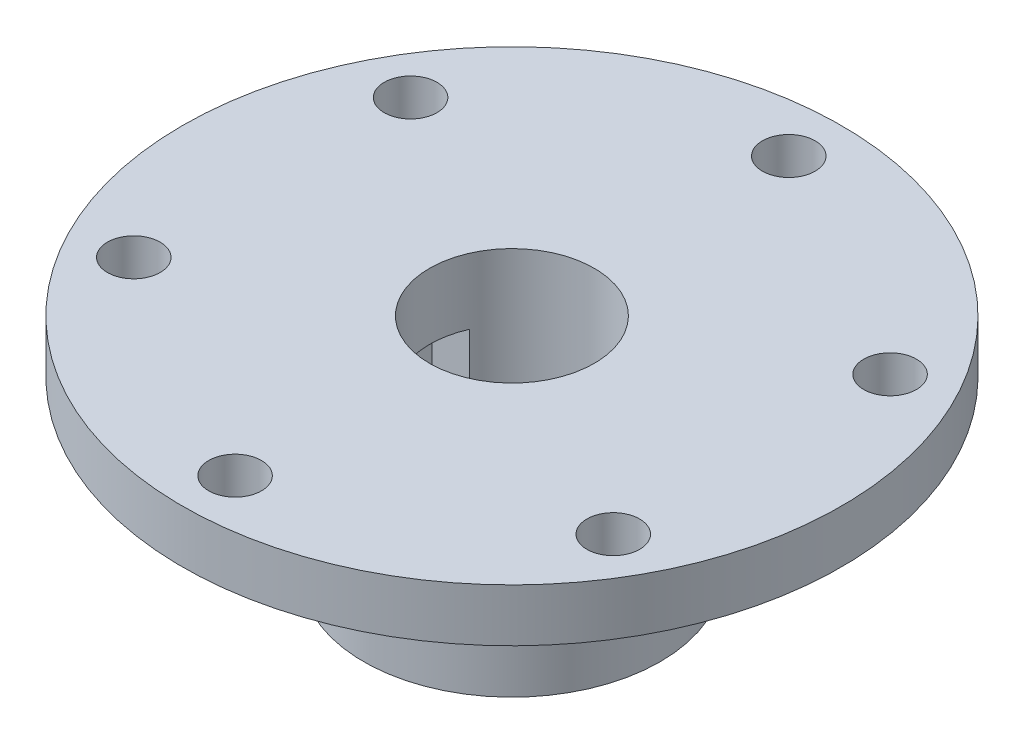
ISO-10303-21;
HEADER;
FILE_DESCRIPTION(('STEP AP214'),'2;1');
FILE_NAME('part.step','',(''),(''),'','','');
FILE_SCHEMA(('AUTOMOTIVE_DESIGN { 1 0 10303 214 1 1 1 1 }'));
ENDSEC;
DATA;
#1=APPLICATION_CONTEXT('core data for automotive mechanical design processes');
#2=APPLICATION_PROTOCOL_DEFINITION('international standard','automotive_design',2000,#1);
#3=PRODUCT_CONTEXT('',#1,'mechanical');
#4=PRODUCT('Part','Part','',(#3));
#5=PRODUCT_RELATED_PRODUCT_CATEGORY('part','',(#4));
#6=PRODUCT_DEFINITION_FORMATION('','',#4);
#7=PRODUCT_DEFINITION_CONTEXT('part definition',#1,'design');
#8=PRODUCT_DEFINITION('design','',#6,#7);
#9=PRODUCT_DEFINITION_SHAPE('','',#8);
#10=(LENGTH_UNIT() NAMED_UNIT(*) SI_UNIT(.MILLI.,.METRE.));
#11=(NAMED_UNIT(*) PLANE_ANGLE_UNIT() SI_UNIT($,.RADIAN.));
#12=(NAMED_UNIT(*) SI_UNIT($,.STERADIAN.) SOLID_ANGLE_UNIT());
#13=UNCERTAINTY_MEASURE_WITH_UNIT(LENGTH_MEASURE(1.E-05),#10,'distance_accuracy_value','');
#14=(GEOMETRIC_REPRESENTATION_CONTEXT(3) GLOBAL_UNCERTAINTY_ASSIGNED_CONTEXT((#13)) GLOBAL_UNIT_ASSIGNED_CONTEXT((#10,
#11,#12)) REPRESENTATION_CONTEXT('',''));
#15=CARTESIAN_POINT('',(0.,0.,0.));
#16=DIRECTION('',(0.,0.,1.));
#17=DIRECTION('',(1.,0.,0.));
#18=AXIS2_PLACEMENT_3D('',#15,#16,#17);
#19=CARTESIAN_POINT('',(0.,0.,0.));
#20=DIRECTION('',(0.,1.,0.));
#21=DIRECTION('',(1.,0.,0.));
#22=AXIS2_PLACEMENT_3D('',#19,#20,#21);
#23=PLANE('',#22);
#24=DIRECTION('',(-1.,0.,0.));
#25=VECTOR('',#24,1.);
#26=CARTESIAN_POINT('',(-5.7282196186948,0.,2.5));
#27=LINE('',#26,#25);
#28=CARTESIAN_POINT('',(-5.7282196186948,0.,2.5));
#29=VERTEX_POINT('',#28);
#30=CARTESIAN_POINT('',(-8.55,0.,2.5));
#31=VERTEX_POINT('',#30);
#32=EDGE_CURVE('E212',#29,#31,#27,.T.);
#33=ORIENTED_EDGE('',*,*,#32,.F.);
#34=CARTESIAN_POINT('',(0.,0.,0.));
#35=DIRECTION('',(0.,-1.,0.));
#36=DIRECTION('',(0.974996043043569,0.,-0.222222222222222));
#37=AXIS2_PLACEMENT_3D('',#34,#35,#36);
#38=CIRCLE('',#37,6.25);
#39=CARTESIAN_POINT('',(-5.7282196186948,0.,-2.5));
#40=VERTEX_POINT('',#39);
#41=EDGE_CURVE('E157',#40,#29,#38,.T.);
#42=ORIENTED_EDGE('',*,*,#41,.F.);
#43=DIRECTION('',(1.,0.,0.));
#44=VECTOR('',#43,1.);
#45=CARTESIAN_POINT('',(-8.55,0.,-2.5));
#46=LINE('',#45,#44);
#47=CARTESIAN_POINT('',(-8.55,0.,-2.5));
#48=VERTEX_POINT('',#47);
#49=EDGE_CURVE('E148',#48,#40,#46,.T.);
#50=ORIENTED_EDGE('',*,*,#49,.F.);
#51=DIRECTION('',(0.,0.,-1.));
#52=VECTOR('',#51,1.);
#53=CARTESIAN_POINT('',(-8.55,0.,2.5));
#54=LINE('',#53,#52);
#55=EDGE_CURVE('E140',#31,#48,#54,.T.);
#56=ORIENTED_EDGE('',*,*,#55,.F.);
#57=EDGE_LOOP('',(#33,#42,#50,#56));
#58=FACE_BOUND('',#57,.T.);
#59=CARTESIAN_POINT('',(0.,0.,0.));
#60=DIRECTION('',(0.,1.,0.));
#61=DIRECTION('',(-1.,0.,0.));
#62=AXIS2_PLACEMENT_3D('',#59,#60,#61);
#63=CIRCLE('',#62,11.25);
#64=CARTESIAN_POINT('',(11.25,0.,0.));
#65=VERTEX_POINT('',#64);
#66=EDGE_CURVE('E11',#65,#65,#63,.T.);
#67=ORIENTED_EDGE('',*,*,#66,.F.);
#68=EDGE_LOOP('',(#67));
#69=FACE_BOUND('',#68,.T.);
#70=ADVANCED_FACE('F17',(#58,#69),#23,.F.);
#71=CARTESIAN_POINT('',(0.,0.,0.));
#72=DIRECTION('',(0.,1.,0.));
#73=DIRECTION('',(-1.,0.,0.));
#74=AXIS2_PLACEMENT_3D('',#71,#72,#73);
#75=CYLINDRICAL_SURFACE('',#74,11.25);
#76=CARTESIAN_POINT('',(0.,12.1,0.));
#77=DIRECTION('',(0.,1.,0.));
#78=DIRECTION('',(-1.,0.,0.));
#79=AXIS2_PLACEMENT_3D('',#76,#77,#78);
#80=CIRCLE('',#79,11.25);
#81=CARTESIAN_POINT('',(11.25,12.1,0.));
#82=VERTEX_POINT('',#81);
#83=EDGE_CURVE('E193',#82,#82,#80,.T.);
#84=ORIENTED_EDGE('',*,*,#83,.F.);
#85=DIRECTION('',(0.,-1.,0.));
#86=VECTOR('',#85,1.);
#87=CARTESIAN_POINT('',(11.25,0.,0.));
#88=LINE('',#87,#86);
#89=EDGE_CURVE('E28',#82,#65,#88,.T.);
#90=ORIENTED_EDGE('',*,*,#89,.T.);
#91=ORIENTED_EDGE('',*,*,#66,.T.);
#92=ORIENTED_EDGE('',*,*,#89,.F.);
#93=EDGE_LOOP('',(#84,#90,#91,#92));
#94=FACE_BOUND('',#93,.T.);
#95=ADVANCED_FACE('F283',(#94),#75,.T.);
#96=CARTESIAN_POINT('',(-5.7282196186948,0.,2.5));
#97=DIRECTION('',(0.,0.,-1.));
#98=DIRECTION('',(0.,-1.,0.));
#99=AXIS2_PLACEMENT_3D('',#96,#97,#98);
#100=PLANE('',#99);
#101=ORIENTED_EDGE('',*,*,#32,.T.);
#102=DIRECTION('',(0.,1.,0.));
#103=VECTOR('',#102,1.);
#104=CARTESIAN_POINT('',(-8.55,0.,2.5));
#105=LINE('',#104,#103);
#106=CARTESIAN_POINT('',(-8.55,12.1,2.5));
#107=VERTEX_POINT('',#106);
#108=EDGE_CURVE('E142',#31,#107,#105,.T.);
#109=ORIENTED_EDGE('',*,*,#108,.T.);
#110=DIRECTION('',(-1.,0.,0.));
#111=VECTOR('',#110,1.);
#112=CARTESIAN_POINT('',(-5.7282196186948,12.1,2.5));
#113=LINE('',#112,#111);
#114=CARTESIAN_POINT('',(-5.7282196186948,12.1,2.5));
#115=VERTEX_POINT('',#114);
#116=EDGE_CURVE('E188',#115,#107,#113,.T.);
#117=ORIENTED_EDGE('',*,*,#116,.F.);
#118=DIRECTION('',(0.,1.,0.));
#119=VECTOR('',#118,1.);
#120=CARTESIAN_POINT('',(-5.7282196186948,0.,2.5));
#121=LINE('',#120,#119);
#122=EDGE_CURVE('E159',#29,#115,#121,.T.);
#123=ORIENTED_EDGE('',*,*,#122,.F.);
#124=EDGE_LOOP('',(#101,#109,#117,#123));
#125=FACE_BOUND('',#124,.T.);
#126=ADVANCED_FACE('F285',(#125),#100,.T.);
#127=CARTESIAN_POINT('',(-8.55,0.,2.5));
#128=DIRECTION('',(1.,0.,0.));
#129=DIRECTION('',(0.,1.,0.));
#130=AXIS2_PLACEMENT_3D('',#127,#128,#129);
#131=PLANE('',#130);
#132=ORIENTED_EDGE('',*,*,#55,.T.);
#133=DIRECTION('',(0.,1.,0.));
#134=VECTOR('',#133,1.);
#135=CARTESIAN_POINT('',(-8.55,0.,-2.5));
#136=LINE('',#135,#134);
#137=CARTESIAN_POINT('',(-8.55,12.1,-2.5));
#138=VERTEX_POINT('',#137);
#139=EDGE_CURVE('E106',#48,#138,#136,.T.);
#140=ORIENTED_EDGE('',*,*,#139,.T.);
#141=DIRECTION('',(0.,0.,-1.));
#142=VECTOR('',#141,1.);
#143=CARTESIAN_POINT('',(-8.55,12.1,2.5));
#144=LINE('',#143,#142);
#145=EDGE_CURVE('E192',#107,#138,#144,.T.);
#146=ORIENTED_EDGE('',*,*,#145,.F.);
#147=ORIENTED_EDGE('',*,*,#108,.F.);
#148=EDGE_LOOP('',(#132,#140,#146,#147));
#149=FACE_BOUND('',#148,.T.);
#150=ADVANCED_FACE('F141',(#149),#131,.T.);
#151=CARTESIAN_POINT('',(-8.55,0.,-2.5));
#152=DIRECTION('',(0.,0.,1.));
#153=DIRECTION('',(1.,0.,0.));
#154=AXIS2_PLACEMENT_3D('',#151,#152,#153);
#155=PLANE('',#154);
#156=ORIENTED_EDGE('',*,*,#49,.T.);
#157=DIRECTION('',(0.,1.,0.));
#158=VECTOR('',#157,1.);
#159=CARTESIAN_POINT('',(-5.7282196186948,0.,-2.5));
#160=LINE('',#159,#158);
#161=CARTESIAN_POINT('',(-5.7282196186948,12.1,-2.5));
#162=VERTEX_POINT('',#161);
#163=EDGE_CURVE('E91',#40,#162,#160,.T.);
#164=ORIENTED_EDGE('',*,*,#163,.T.);
#165=DIRECTION('',(1.,0.,0.));
#166=VECTOR('',#165,1.);
#167=CARTESIAN_POINT('',(-8.55,12.1,-2.5));
#168=LINE('',#167,#166);
#169=EDGE_CURVE('E151',#138,#162,#168,.T.);
#170=ORIENTED_EDGE('',*,*,#169,.F.);
#171=ORIENTED_EDGE('',*,*,#139,.F.);
#172=EDGE_LOOP('',(#156,#164,#170,#171));
#173=FACE_BOUND('',#172,.T.);
#174=ADVANCED_FACE('F147',(#173),#155,.T.);
#175=CARTESIAN_POINT('',(0.,0.,0.));
#176=DIRECTION('',(0.,1.,0.));
#177=DIRECTION('',(0.974996043043569,0.,-0.222222222222222));
#178=AXIS2_PLACEMENT_3D('',#175,#176,#177);
#179=CYLINDRICAL_SURFACE('',#178,6.25);
#180=CARTESIAN_POINT('',(0.,17.1,0.));
#181=DIRECTION('',(0.,-1.,0.));
#182=DIRECTION('',(-1.,0.,0.));
#183=AXIS2_PLACEMENT_3D('',#180,#181,#182);
#184=CIRCLE('',#183,6.25);
#185=CARTESIAN_POINT('',(-6.09372526902231,17.1,1.38888888888889));
#186=VERTEX_POINT('',#185);
#187=EDGE_CURVE('E182',#186,#186,#184,.T.);
#188=ORIENTED_EDGE('',*,*,#187,.F.);
#189=DIRECTION('',(0.,-1.,0.));
#190=VECTOR('',#189,1.);
#191=CARTESIAN_POINT('',(-6.09372526902231,0.,1.38888888888889));
#192=LINE('',#191,#190);
#193=CARTESIAN_POINT('',(-6.09372526902231,12.1,1.38888888888889));
#194=VERTEX_POINT('',#193);
#195=EDGE_CURVE('E248',#186,#194,#192,.T.);
#196=ORIENTED_EDGE('',*,*,#195,.T.);
#197=CARTESIAN_POINT('',(0.,12.1,0.));
#198=DIRECTION('',(0.,-1.,0.));
#199=DIRECTION('',(-1.,0.,0.));
#200=AXIS2_PLACEMENT_3D('',#197,#198,#199);
#201=CIRCLE('',#200,6.25);
#202=EDGE_CURVE('E174',#194,#162,#201,.T.);
#203=ORIENTED_EDGE('',*,*,#202,.T.);
#204=ORIENTED_EDGE('',*,*,#163,.F.);
#205=ORIENTED_EDGE('',*,*,#41,.T.);
#206=ORIENTED_EDGE('',*,*,#122,.T.);
#207=CARTESIAN_POINT('',(0.,12.1,0.));
#208=DIRECTION('',(0.,-1.,0.));
#209=DIRECTION('',(-1.,0.,0.));
#210=AXIS2_PLACEMENT_3D('',#207,#208,#209);
#211=CIRCLE('',#210,6.25);
#212=EDGE_CURVE('E171',#115,#194,#211,.T.);
#213=ORIENTED_EDGE('',*,*,#212,.T.);
#214=ORIENTED_EDGE('',*,*,#195,.F.);
#215=EDGE_LOOP('',(#188,#196,#203,#204,#205,#206,#213,#214));
#216=FACE_BOUND('',#215,.T.);
#217=ADVANCED_FACE('F296',(#216),#179,.F.);
#218=CARTESIAN_POINT('',(0.,12.1,0.));
#219=DIRECTION('',(0.,1.,0.));
#220=DIRECTION('',(1.,0.,0.));
#221=AXIS2_PLACEMENT_3D('',#218,#219,#220);
#222=CYLINDRICAL_SURFACE('',#221,13.);
#223=CARTESIAN_POINT('',(0.,13.1,0.));
#224=DIRECTION('',(0.,1.,0.));
#225=DIRECTION('',(1.,0.,0.));
#226=AXIS2_PLACEMENT_3D('',#223,#224,#225);
#227=CIRCLE('',#226,13.);
#228=CARTESIAN_POINT('',(-13.,13.1,0.));
#229=VERTEX_POINT('',#228);
#230=EDGE_CURVE('E219',#229,#229,#227,.T.);
#231=ORIENTED_EDGE('',*,*,#230,.F.);
#232=DIRECTION('',(0.,-1.,0.));
#233=VECTOR('',#232,1.);
#234=CARTESIAN_POINT('',(-13.,12.1,0.));
#235=LINE('',#234,#233);
#236=CARTESIAN_POINT('',(-13.,12.1,0.));
#237=VERTEX_POINT('',#236);
#238=EDGE_CURVE('E169',#229,#237,#235,.T.);
#239=ORIENTED_EDGE('',*,*,#238,.T.);
#240=CARTESIAN_POINT('',(0.,12.1,0.));
#241=DIRECTION('',(0.,1.,0.));
#242=DIRECTION('',(1.,0.,0.));
#243=AXIS2_PLACEMENT_3D('',#240,#241,#242);
#244=CIRCLE('',#243,13.);
#245=EDGE_CURVE('E186',#237,#237,#244,.T.);
#246=ORIENTED_EDGE('',*,*,#245,.T.);
#247=ORIENTED_EDGE('',*,*,#238,.F.);
#248=EDGE_LOOP('',(#231,#239,#246,#247));
#249=FACE_BOUND('',#248,.T.);
#250=ADVANCED_FACE('F299',(#249),#222,.T.);
#251=CARTESIAN_POINT('',(0.,12.1,0.));
#252=DIRECTION('',(0.,1.,0.));
#253=DIRECTION('',(1.,0.,0.));
#254=AXIS2_PLACEMENT_3D('',#251,#252,#253);
#255=PLANE('',#254);
#256=ORIENTED_EDGE('',*,*,#116,.T.);
#257=ORIENTED_EDGE('',*,*,#145,.T.);
#258=ORIENTED_EDGE('',*,*,#169,.T.);
#259=ORIENTED_EDGE('',*,*,#202,.F.);
#260=ORIENTED_EDGE('',*,*,#212,.F.);
#261=EDGE_LOOP('',(#256,#257,#258,#259,#260));
#262=FACE_BOUND('',#261,.T.);
#263=ADVANCED_FACE('F304',(#262),#255,.F.);
#264=CARTESIAN_POINT('',(0.,12.1,0.));
#265=DIRECTION('',(0.,1.,0.));
#266=DIRECTION('',(1.,0.,0.));
#267=AXIS2_PLACEMENT_3D('',#264,#265,#266);
#268=PLANE('',#267);
#269=ORIENTED_EDGE('',*,*,#83,.T.);
#270=EDGE_LOOP('',(#269));
#271=FACE_BOUND('',#270,.T.);
#272=ORIENTED_EDGE('',*,*,#245,.F.);
#273=EDGE_LOOP('',(#272));
#274=FACE_BOUND('',#273,.T.);
#275=ADVANCED_FACE('F281',(#271,#274),#268,.F.);
#276=CARTESIAN_POINT('',(0.,17.1,0.));
#277=DIRECTION('',(0.,1.,0.));
#278=DIRECTION('',(1.,0.,0.));
#279=AXIS2_PLACEMENT_3D('',#276,#277,#278);
#280=PLANE('',#279);
#281=ORIENTED_EDGE('',*,*,#187,.T.);
#282=EDGE_LOOP('',(#281));
#283=FACE_BOUND('',#282,.T.);
#284=CARTESIAN_POINT('',(-18.1865334794732,17.1,10.5));
#285=DIRECTION('',(0.,-1.,0.));
#286=DIRECTION('',(1.,0.,0.));
#287=AXIS2_PLACEMENT_3D('',#284,#285,#286);
#288=CIRCLE('',#287,2.);
#289=CARTESIAN_POINT('',(-20.1865334794732,17.1,10.5));
#290=VERTEX_POINT('',#289);
#291=EDGE_CURVE('E241',#290,#290,#288,.T.);
#292=ORIENTED_EDGE('',*,*,#291,.T.);
#293=EDGE_LOOP('',(#292));
#294=FACE_BOUND('',#293,.T.);
#295=CARTESIAN_POINT('',(0.,17.1,-21.));
#296=DIRECTION('',(0.,-1.,0.));
#297=DIRECTION('',(1.,0.,0.));
#298=AXIS2_PLACEMENT_3D('',#295,#296,#297);
#299=CIRCLE('',#298,2.);
#300=CARTESIAN_POINT('',(-2.,17.1,-21.));
#301=VERTEX_POINT('',#300);
#302=EDGE_CURVE('E204',#301,#301,#299,.T.);
#303=ORIENTED_EDGE('',*,*,#302,.T.);
#304=EDGE_LOOP('',(#303));
#305=FACE_BOUND('',#304,.T.);
#306=CARTESIAN_POINT('',(18.1865334794732,17.1,-10.5));
#307=DIRECTION('',(0.,-1.,0.));
#308=DIRECTION('',(1.,0.,0.));
#309=AXIS2_PLACEMENT_3D('',#306,#307,#308);
#310=CIRCLE('',#309,2.);
#311=CARTESIAN_POINT('',(16.1865334794732,17.1,-10.5));
#312=VERTEX_POINT('',#311);
#313=EDGE_CURVE('E176',#312,#312,#310,.T.);
#314=ORIENTED_EDGE('',*,*,#313,.T.);
#315=EDGE_LOOP('',(#314));
#316=FACE_BOUND('',#315,.T.);
#317=CARTESIAN_POINT('',(0.,17.1,21.));
#318=DIRECTION('',(0.,-1.,0.));
#319=DIRECTION('',(1.,0.,0.));
#320=AXIS2_PLACEMENT_3D('',#317,#318,#319);
#321=CIRCLE('',#320,2.);
#322=CARTESIAN_POINT('',(-2.,17.1,21.));
#323=VERTEX_POINT('',#322);
#324=EDGE_CURVE('E251',#323,#323,#321,.T.);
#325=ORIENTED_EDGE('',*,*,#324,.T.);
#326=EDGE_LOOP('',(#325));
#327=FACE_BOUND('',#326,.T.);
#328=CARTESIAN_POINT('',(-18.1865334794732,17.1,-10.5));
#329=DIRECTION('',(0.,-1.,0.));
#330=DIRECTION('',(1.,0.,0.));
#331=AXIS2_PLACEMENT_3D('',#328,#329,#330);
#332=CIRCLE('',#331,2.);
#333=CARTESIAN_POINT('',(-20.1865334794732,17.1,-10.5));
#334=VERTEX_POINT('',#333);
#335=EDGE_CURVE('E213',#334,#334,#332,.T.);
#336=ORIENTED_EDGE('',*,*,#335,.T.);
#337=EDGE_LOOP('',(#336));
#338=FACE_BOUND('',#337,.T.);
#339=CARTESIAN_POINT('',(18.1865334794732,17.1,10.5));
#340=DIRECTION('',(0.,-1.,0.));
#341=DIRECTION('',(1.,0.,0.));
#342=AXIS2_PLACEMENT_3D('',#339,#340,#341);
#343=CIRCLE('',#342,2.);
#344=CARTESIAN_POINT('',(16.1865334794732,17.1,10.5));
#345=VERTEX_POINT('',#344);
#346=EDGE_CURVE('E194',#345,#345,#343,.T.);
#347=ORIENTED_EDGE('',*,*,#346,.T.);
#348=EDGE_LOOP('',(#347));
#349=FACE_BOUND('',#348,.T.);
#350=CARTESIAN_POINT('',(0.,17.1,0.));
#351=DIRECTION('',(0.,1.,0.));
#352=DIRECTION('',(1.,0.,0.));
#353=AXIS2_PLACEMENT_3D('',#350,#351,#352);
#354=CIRCLE('',#353,25.);
#355=CARTESIAN_POINT('',(-25.,17.1,0.));
#356=VERTEX_POINT('',#355);
#357=EDGE_CURVE('E222',#356,#356,#354,.T.);
#358=ORIENTED_EDGE('',*,*,#357,.T.);
#359=EDGE_LOOP('',(#358));
#360=FACE_BOUND('',#359,.T.);
#361=ADVANCED_FACE('F303',(#283,#294,#305,#316,#327,#338,#349,#360),#280,.T.);
#362=CARTESIAN_POINT('',(0.,13.1,0.));
#363=DIRECTION('',(0.,1.,0.));
#364=DIRECTION('',(1.,0.,0.));
#365=AXIS2_PLACEMENT_3D('',#362,#363,#364);
#366=CYLINDRICAL_SURFACE('',#365,25.);
#367=ORIENTED_EDGE('',*,*,#357,.F.);
#368=DIRECTION('',(0.,-1.,0.));
#369=VECTOR('',#368,1.);
#370=CARTESIAN_POINT('',(-25.,13.1,0.));
#371=LINE('',#370,#369);
#372=CARTESIAN_POINT('',(-25.,13.1,0.));
#373=VERTEX_POINT('',#372);
#374=EDGE_CURVE('E187',#356,#373,#371,.T.);
#375=ORIENTED_EDGE('',*,*,#374,.T.);
#376=CARTESIAN_POINT('',(0.,13.1,0.));
#377=DIRECTION('',(0.,1.,0.));
#378=DIRECTION('',(1.,0.,0.));
#379=AXIS2_PLACEMENT_3D('',#376,#377,#378);
#380=CIRCLE('',#379,25.);
#381=EDGE_CURVE('E223',#373,#373,#380,.T.);
#382=ORIENTED_EDGE('',*,*,#381,.T.);
#383=ORIENTED_EDGE('',*,*,#374,.F.);
#384=EDGE_LOOP('',(#367,#375,#382,#383));
#385=FACE_BOUND('',#384,.T.);
#386=ADVANCED_FACE('F326',(#385),#366,.T.);
#387=CARTESIAN_POINT('',(0.,13.1,0.));
#388=DIRECTION('',(0.,1.,0.));
#389=DIRECTION('',(1.,0.,0.));
#390=AXIS2_PLACEMENT_3D('',#387,#388,#389);
#391=PLANE('',#390);
#392=ORIENTED_EDGE('',*,*,#230,.T.);
#393=EDGE_LOOP('',(#392));
#394=FACE_BOUND('',#393,.T.);
#395=CARTESIAN_POINT('',(-18.1865334794732,13.1,10.5));
#396=DIRECTION('',(0.,1.,0.));
#397=DIRECTION('',(1.,0.,0.));
#398=AXIS2_PLACEMENT_3D('',#395,#396,#397);
#399=CIRCLE('',#398,2.);
#400=CARTESIAN_POINT('',(-20.1865334794732,13.1,10.5));
#401=VERTEX_POINT('',#400);
#402=EDGE_CURVE('E225',#401,#401,#399,.T.);
#403=ORIENTED_EDGE('',*,*,#402,.T.);
#404=EDGE_LOOP('',(#403));
#405=FACE_BOUND('',#404,.T.);
#406=CARTESIAN_POINT('',(0.,13.1,-21.));
#407=DIRECTION('',(0.,1.,0.));
#408=DIRECTION('',(1.,0.,0.));
#409=AXIS2_PLACEMENT_3D('',#406,#407,#408);
#410=CIRCLE('',#409,2.);
#411=CARTESIAN_POINT('',(-2.,13.1,-21.));
#412=VERTEX_POINT('',#411);
#413=EDGE_CURVE('E203',#412,#412,#410,.T.);
#414=ORIENTED_EDGE('',*,*,#413,.T.);
#415=EDGE_LOOP('',(#414));
#416=FACE_BOUND('',#415,.T.);
#417=CARTESIAN_POINT('',(18.1865334794732,13.1,-10.5));
#418=DIRECTION('',(0.,1.,0.));
#419=DIRECTION('',(1.,0.,0.));
#420=AXIS2_PLACEMENT_3D('',#417,#418,#419);
#421=CIRCLE('',#420,2.);
#422=CARTESIAN_POINT('',(16.1865334794732,13.1,-10.5));
#423=VERTEX_POINT('',#422);
#424=EDGE_CURVE('E232',#423,#423,#421,.T.);
#425=ORIENTED_EDGE('',*,*,#424,.T.);
#426=EDGE_LOOP('',(#425));
#427=FACE_BOUND('',#426,.T.);
#428=CARTESIAN_POINT('',(0.,13.1,21.));
#429=DIRECTION('',(0.,1.,0.));
#430=DIRECTION('',(1.,0.,0.));
#431=AXIS2_PLACEMENT_3D('',#428,#429,#430);
#432=CIRCLE('',#431,2.);
#433=CARTESIAN_POINT('',(-2.,13.1,21.));
#434=VERTEX_POINT('',#433);
#435=EDGE_CURVE('E181',#434,#434,#432,.T.);
#436=ORIENTED_EDGE('',*,*,#435,.T.);
#437=EDGE_LOOP('',(#436));
#438=FACE_BOUND('',#437,.T.);
#439=CARTESIAN_POINT('',(-18.1865334794732,13.1,-10.5));
#440=DIRECTION('',(0.,1.,0.));
#441=DIRECTION('',(1.,0.,0.));
#442=AXIS2_PLACEMENT_3D('',#439,#440,#441);
#443=CIRCLE('',#442,2.);
#444=CARTESIAN_POINT('',(-20.1865334794732,13.1,-10.5));
#445=VERTEX_POINT('',#444);
#446=EDGE_CURVE('E255',#445,#445,#443,.T.);
#447=ORIENTED_EDGE('',*,*,#446,.T.);
#448=EDGE_LOOP('',(#447));
#449=FACE_BOUND('',#448,.T.);
#450=CARTESIAN_POINT('',(18.1865334794732,13.1,10.5));
#451=DIRECTION('',(0.,1.,0.));
#452=DIRECTION('',(1.,0.,0.));
#453=AXIS2_PLACEMENT_3D('',#450,#451,#452);
#454=CIRCLE('',#453,2.);
#455=CARTESIAN_POINT('',(16.1865334794732,13.1,10.5));
#456=VERTEX_POINT('',#455);
#457=EDGE_CURVE('E218',#456,#456,#454,.T.);
#458=ORIENTED_EDGE('',*,*,#457,.T.);
#459=EDGE_LOOP('',(#458));
#460=FACE_BOUND('',#459,.T.);
#461=ORIENTED_EDGE('',*,*,#381,.F.);
#462=EDGE_LOOP('',(#461));
#463=FACE_BOUND('',#462,.T.);
#464=ADVANCED_FACE('F330',(#394,#405,#416,#427,#438,#449,#460,#463),#391,.F.);
#465=CARTESIAN_POINT('',(-18.1865334794732,17.1,10.5));
#466=DIRECTION('',(0.,-1.,0.));
#467=DIRECTION('',(1.,0.,0.));
#468=AXIS2_PLACEMENT_3D('',#465,#466,#467);
#469=CYLINDRICAL_SURFACE('',#468,2.);
#470=ORIENTED_EDGE('',*,*,#291,.F.);
#471=DIRECTION('',(0.,-1.,0.));
#472=VECTOR('',#471,1.);
#473=CARTESIAN_POINT('',(-20.1865334794732,17.1,10.5));
#474=LINE('',#473,#472);
#475=EDGE_CURVE('E228',#290,#401,#474,.T.);
#476=ORIENTED_EDGE('',*,*,#475,.T.);
#477=ORIENTED_EDGE('',*,*,#402,.F.);
#478=ORIENTED_EDGE('',*,*,#475,.F.);
#479=EDGE_LOOP('',(#470,#476,#477,#478));
#480=FACE_BOUND('',#479,.T.);
#481=ADVANCED_FACE('F334',(#480),#469,.F.);
#482=CARTESIAN_POINT('',(0.,17.1,-21.));
#483=DIRECTION('',(0.,-1.,0.));
#484=DIRECTION('',(1.,0.,0.));
#485=AXIS2_PLACEMENT_3D('',#482,#483,#484);
#486=CYLINDRICAL_SURFACE('',#485,2.);
#487=ORIENTED_EDGE('',*,*,#302,.F.);
#488=DIRECTION('',(0.,-1.,0.));
#489=VECTOR('',#488,1.);
#490=CARTESIAN_POINT('',(-2.,17.1,-21.));
#491=LINE('',#490,#489);
#492=EDGE_CURVE('E199',#301,#412,#491,.T.);
#493=ORIENTED_EDGE('',*,*,#492,.T.);
#494=ORIENTED_EDGE('',*,*,#413,.F.);
#495=ORIENTED_EDGE('',*,*,#492,.F.);
#496=EDGE_LOOP('',(#487,#493,#494,#495));
#497=FACE_BOUND('',#496,.T.);
#498=ADVANCED_FACE('F338',(#497),#486,.F.);
#499=CARTESIAN_POINT('',(18.1865334794732,17.1,-10.5));
#500=DIRECTION('',(0.,-1.,0.));
#501=DIRECTION('',(1.,0.,0.));
#502=AXIS2_PLACEMENT_3D('',#499,#500,#501);
#503=CYLINDRICAL_SURFACE('',#502,2.);
#504=ORIENTED_EDGE('',*,*,#313,.F.);
#505=DIRECTION('',(0.,-1.,0.));
#506=VECTOR('',#505,1.);
#507=CARTESIAN_POINT('',(16.1865334794732,17.1,-10.5));
#508=LINE('',#507,#506);
#509=EDGE_CURVE('E180',#312,#423,#508,.T.);
#510=ORIENTED_EDGE('',*,*,#509,.T.);
#511=ORIENTED_EDGE('',*,*,#424,.F.);
#512=ORIENTED_EDGE('',*,*,#509,.F.);
#513=EDGE_LOOP('',(#504,#510,#511,#512));
#514=FACE_BOUND('',#513,.T.);
#515=ADVANCED_FACE('F19',(#514),#503,.F.);
#516=CARTESIAN_POINT('',(0.,17.1,21.));
#517=DIRECTION('',(0.,-1.,0.));
#518=DIRECTION('',(1.,0.,0.));
#519=AXIS2_PLACEMENT_3D('',#516,#517,#518);
#520=CYLINDRICAL_SURFACE('',#519,2.);
#521=ORIENTED_EDGE('',*,*,#324,.F.);
#522=DIRECTION('',(0.,-1.,0.));
#523=VECTOR('',#522,1.);
#524=CARTESIAN_POINT('',(-2.,17.1,21.));
#525=LINE('',#524,#523);
#526=EDGE_CURVE('E21',#323,#434,#525,.T.);
#527=ORIENTED_EDGE('',*,*,#526,.T.);
#528=ORIENTED_EDGE('',*,*,#435,.F.);
#529=ORIENTED_EDGE('',*,*,#526,.F.);
#530=EDGE_LOOP('',(#521,#527,#528,#529));
#531=FACE_BOUND('',#530,.T.);
#532=ADVANCED_FACE('F305',(#531),#520,.F.);
#533=CARTESIAN_POINT('',(-18.1865334794732,17.1,-10.5));
#534=DIRECTION('',(0.,-1.,0.));
#535=DIRECTION('',(1.,0.,0.));
#536=AXIS2_PLACEMENT_3D('',#533,#534,#535);
#537=CYLINDRICAL_SURFACE('',#536,2.);
#538=ORIENTED_EDGE('',*,*,#335,.F.);
#539=DIRECTION('',(0.,-1.,0.));
#540=VECTOR('',#539,1.);
#541=CARTESIAN_POINT('',(-20.1865334794732,17.1,-10.5));
#542=LINE('',#541,#540);
#543=EDGE_CURVE('E217',#334,#445,#542,.T.);
#544=ORIENTED_EDGE('',*,*,#543,.T.);
#545=ORIENTED_EDGE('',*,*,#446,.F.);
#546=ORIENTED_EDGE('',*,*,#543,.F.);
#547=EDGE_LOOP('',(#538,#544,#545,#546));
#548=FACE_BOUND('',#547,.T.);
#549=ADVANCED_FACE('F308',(#548),#537,.F.);
#550=CARTESIAN_POINT('',(18.1865334794732,17.1,10.5));
#551=DIRECTION('',(0.,-1.,0.));
#552=DIRECTION('',(1.,0.,0.));
#553=AXIS2_PLACEMENT_3D('',#550,#551,#552);
#554=CYLINDRICAL_SURFACE('',#553,2.);
#555=ORIENTED_EDGE('',*,*,#346,.F.);
#556=DIRECTION('',(0.,-1.,0.));
#557=VECTOR('',#556,1.);
#558=CARTESIAN_POINT('',(16.1865334794732,17.1,10.5));
#559=LINE('',#558,#557);
#560=EDGE_CURVE('E198',#345,#456,#559,.T.);
#561=ORIENTED_EDGE('',*,*,#560,.T.);
#562=ORIENTED_EDGE('',*,*,#457,.F.);
#563=ORIENTED_EDGE('',*,*,#560,.F.);
#564=EDGE_LOOP('',(#555,#561,#562,#563));
#565=FACE_BOUND('',#564,.T.);
#566=ADVANCED_FACE('F315',(#565),#554,.F.);
#567=CLOSED_SHELL('',(#70,#95,#126,#150,#174,#217,#250,#263,#275,#361,#386,#464,#481,#498,#515,
#532,#549,#566));
#568=MANIFOLD_SOLID_BREP('B1',#567);
#569=ADVANCED_BREP_SHAPE_REPRESENTATION('',(#18,#568),#14);
#570=SHAPE_DEFINITION_REPRESENTATION(#9,#569);
ENDSEC;
END-ISO-10303-21;
